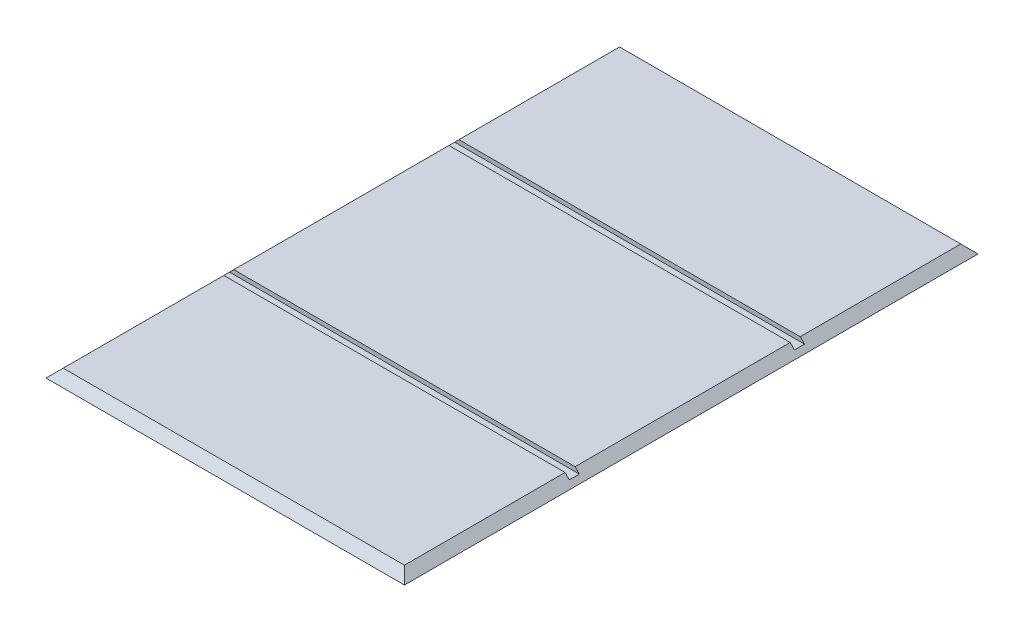
ISO-10303-21;
HEADER;
FILE_DESCRIPTION(('STEP AP214'),'2;1');
FILE_NAME('part.step','',(''),(''),'','','');
FILE_SCHEMA(('AUTOMOTIVE_DESIGN { 1 0 10303 214 1 1 1 1 }'));
ENDSEC;
DATA;
#1=APPLICATION_CONTEXT('core data for automotive mechanical design processes');
#2=APPLICATION_PROTOCOL_DEFINITION('international standard','automotive_design',2000,#1);
#3=PRODUCT_CONTEXT('',#1,'mechanical');
#4=PRODUCT('Part','Part','',(#3));
#5=PRODUCT_RELATED_PRODUCT_CATEGORY('part','',(#4));
#6=PRODUCT_DEFINITION_FORMATION('','',#4);
#7=PRODUCT_DEFINITION_CONTEXT('part definition',#1,'design');
#8=PRODUCT_DEFINITION('design','',#6,#7);
#9=PRODUCT_DEFINITION_SHAPE('','',#8);
#10=(LENGTH_UNIT() NAMED_UNIT(*) SI_UNIT(.MILLI.,.METRE.));
#11=(NAMED_UNIT(*) PLANE_ANGLE_UNIT() SI_UNIT($,.RADIAN.));
#12=(NAMED_UNIT(*) SI_UNIT($,.STERADIAN.) SOLID_ANGLE_UNIT());
#13=UNCERTAINTY_MEASURE_WITH_UNIT(LENGTH_MEASURE(1.E-05),#10,'distance_accuracy_value','');
#14=(GEOMETRIC_REPRESENTATION_CONTEXT(3) GLOBAL_UNCERTAINTY_ASSIGNED_CONTEXT((#13)) GLOBAL_UNIT_ASSIGNED_CONTEXT((#10,
#11,#12)) REPRESENTATION_CONTEXT('',''));
#15=CARTESIAN_POINT('',(0.,0.,0.));
#16=DIRECTION('',(0.,0.,1.));
#17=DIRECTION('',(1.,0.,0.));
#18=AXIS2_PLACEMENT_3D('',#15,#16,#17);
#19=CARTESIAN_POINT('',(0.,12.,-550.));
#20=DIRECTION('',(0.,0.,-1.));
#21=DIRECTION('',(-1.,0.,0.));
#22=AXIS2_PLACEMENT_3D('',#19,#20,#21);
#23=PLANE('',#22);
#24=DIRECTION('',(1.,0.,0.));
#25=VECTOR('',#24,1.);
#26=CARTESIAN_POINT('',(0.,12.,-550.));
#27=LINE('',#26,#25);
#28=CARTESIAN_POINT('',(12.,12.,-550.));
#29=VERTEX_POINT('',#28);
#30=CARTESIAN_POINT('',(488.,12.,-550.));
#31=VERTEX_POINT('',#30);
#32=EDGE_CURVE('E143',#29,#31,#27,.T.);
#33=ORIENTED_EDGE('',*,*,#32,.T.);
#34=DIRECTION('',(0.707106781186548,-0.707106781186548,0.));
#35=VECTOR('',#34,1.);
#36=CARTESIAN_POINT('',(244.,256.,-550.));
#37=LINE('',#36,#35);
#38=CARTESIAN_POINT('',(494.,6.,-550.));
#39=VERTEX_POINT('',#38);
#40=EDGE_CURVE('E205',#31,#39,#37,.T.);
#41=ORIENTED_EDGE('',*,*,#40,.T.);
#42=DIRECTION('',(1.,0.,0.));
#43=VECTOR('',#42,1.);
#44=CARTESIAN_POINT('',(0.,6.,-550.));
#45=LINE('',#44,#43);
#46=CARTESIAN_POINT('',(6.00000000000001,6.,-550.));
#47=VERTEX_POINT('',#46);
#48=EDGE_CURVE('E263',#47,#39,#45,.T.);
#49=ORIENTED_EDGE('',*,*,#48,.F.);
#50=DIRECTION('',(-0.707106781186548,-0.707106781186548,0.));
#51=VECTOR('',#50,1.);
#52=CARTESIAN_POINT('',(6.00000000000001,5.99999999999999,-550.));
#53=LINE('',#52,#51);
#54=EDGE_CURVE('E202',#47,#29,#53,.F.);
#55=ORIENTED_EDGE('',*,*,#54,.T.);
#56=EDGE_LOOP('',(#33,#41,#49,#55));
#57=FACE_BOUND('',#56,.T.);
#58=ADVANCED_FACE('F41',(#57),#23,.T.);
#59=CARTESIAN_POINT('',(0.,12.,-250.));
#60=DIRECTION('',(0.,0.,-1.));
#61=DIRECTION('',(-1.,0.,0.));
#62=AXIS2_PLACEMENT_3D('',#59,#60,#61);
#63=PLANE('',#62);
#64=DIRECTION('',(1.,0.,0.));
#65=VECTOR('',#64,1.);
#66=CARTESIAN_POINT('',(0.,6.,-250.));
#67=LINE('',#66,#65);
#68=CARTESIAN_POINT('',(6.00000000000001,6.,-250.));
#69=VERTEX_POINT('',#68);
#70=CARTESIAN_POINT('',(494.,6.,-250.));
#71=VERTEX_POINT('',#70);
#72=EDGE_CURVE('E286',#69,#71,#67,.T.);
#73=ORIENTED_EDGE('',*,*,#72,.T.);
#74=DIRECTION('',(-0.707106781186548,0.707106781186548,0.));
#75=VECTOR('',#74,1.);
#76=CARTESIAN_POINT('',(488.,12.,-250.));
#77=LINE('',#76,#75);
#78=CARTESIAN_POINT('',(488.,12.,-250.));
#79=VERTEX_POINT('',#78);
#80=EDGE_CURVE('E213',#71,#79,#77,.T.);
#81=ORIENTED_EDGE('',*,*,#80,.T.);
#82=DIRECTION('',(1.,0.,0.));
#83=VECTOR('',#82,1.);
#84=CARTESIAN_POINT('',(0.,12.,-250.));
#85=LINE('',#84,#83);
#86=CARTESIAN_POINT('',(12.,12.,-250.));
#87=VERTEX_POINT('',#86);
#88=EDGE_CURVE('E180',#87,#79,#85,.T.);
#89=ORIENTED_EDGE('',*,*,#88,.F.);
#90=DIRECTION('',(0.707106781186548,0.707106781186548,0.));
#91=VECTOR('',#90,1.);
#92=CARTESIAN_POINT('',(0.,0.,-250.));
#93=LINE('',#92,#91);
#94=EDGE_CURVE('E209',#87,#69,#93,.F.);
#95=ORIENTED_EDGE('',*,*,#94,.T.);
#96=EDGE_LOOP('',(#73,#81,#89,#95));
#97=FACE_BOUND('',#96,.T.);
#98=ADVANCED_FACE('F281',(#97),#63,.F.);
#99=CARTESIAN_POINT('',(0.,12.,0.));
#100=DIRECTION('',(0.,1.,0.));
#101=DIRECTION('',(0.,0.,1.));
#102=AXIS2_PLACEMENT_3D('',#99,#100,#101);
#103=PLANE('',#102);
#104=ORIENTED_EDGE('',*,*,#88,.T.);
#105=DIRECTION('',(0.,0.,-1.));
#106=VECTOR('',#105,1.);
#107=CARTESIAN_POINT('',(488.,12.,-550.));
#108=LINE('',#107,#106);
#109=EDGE_CURVE('E198',#79,#31,#108,.T.);
#110=ORIENTED_EDGE('',*,*,#109,.T.);
#111=ORIENTED_EDGE('',*,*,#32,.F.);
#112=DIRECTION('',(0.,0.,1.));
#113=VECTOR('',#112,1.);
#114=CARTESIAN_POINT('',(12.,12.,0.));
#115=LINE('',#114,#113);
#116=EDGE_CURVE('E195',#29,#87,#115,.T.);
#117=ORIENTED_EDGE('',*,*,#116,.T.);
#118=EDGE_LOOP('',(#104,#110,#111,#117));
#119=FACE_BOUND('',#118,.T.);
#120=ADVANCED_FACE('F279',(#119),#103,.T.);
#121=CARTESIAN_POINT('',(0.,0.,0.));
#122=DIRECTION('',(0.,1.,0.));
#123=DIRECTION('',(0.,0.,1.));
#124=AXIS2_PLACEMENT_3D('',#121,#122,#123);
#125=PLANE('',#124);
#126=DIRECTION('',(0.,0.,-1.));
#127=VECTOR('',#126,1.);
#128=CARTESIAN_POINT('',(0.,0.,0.));
#129=LINE('',#128,#127);
#130=CARTESIAN_POINT('',(0.,0.,0.));
#131=VERTEX_POINT('',#130);
#132=CARTESIAN_POINT('',(0.,0.,-800.));
#133=VERTEX_POINT('',#132);
#134=EDGE_CURVE('E144',#131,#133,#129,.T.);
#135=ORIENTED_EDGE('',*,*,#134,.T.);
#136=DIRECTION('',(1.,0.,0.));
#137=VECTOR('',#136,1.);
#138=CARTESIAN_POINT('',(0.,0.,-800.));
#139=LINE('',#138,#137);
#140=CARTESIAN_POINT('',(500.,0.,-800.));
#141=VERTEX_POINT('',#140);
#142=EDGE_CURVE('E147',#133,#141,#139,.T.);
#143=ORIENTED_EDGE('',*,*,#142,.T.);
#144=DIRECTION('',(0.,0.,-1.));
#145=VECTOR('',#144,1.);
#146=CARTESIAN_POINT('',(500.,0.,0.));
#147=LINE('',#146,#145);
#148=CARTESIAN_POINT('',(500.,0.,0.));
#149=VERTEX_POINT('',#148);
#150=EDGE_CURVE('E131',#149,#141,#147,.T.);
#151=ORIENTED_EDGE('',*,*,#150,.F.);
#152=DIRECTION('',(1.,0.,0.));
#153=VECTOR('',#152,1.);
#154=CARTESIAN_POINT('',(0.,0.,0.));
#155=LINE('',#154,#153);
#156=EDGE_CURVE('E154',#131,#149,#155,.T.);
#157=ORIENTED_EDGE('',*,*,#156,.F.);
#158=EDGE_LOOP('',(#135,#143,#151,#157));
#159=FACE_BOUND('',#158,.T.);
#160=ADVANCED_FACE('F148',(#159),#125,.F.);
#161=CARTESIAN_POINT('',(0.,6.,0.));
#162=DIRECTION('',(0.,1.,0.));
#163=DIRECTION('',(0.,0.,1.));
#164=AXIS2_PLACEMENT_3D('',#161,#162,#163);
#165=PLANE('',#164);
#166=ORIENTED_EDGE('',*,*,#72,.F.);
#167=DIRECTION('',(0.,0.,-1.));
#168=VECTOR('',#167,1.);
#169=CARTESIAN_POINT('',(6.00000000000001,6.,0.));
#170=LINE('',#169,#168);
#171=CARTESIAN_POINT('',(6.00000000000001,6.,-236.));
#172=VERTEX_POINT('',#171);
#173=EDGE_CURVE('E214',#69,#172,#170,.F.);
#174=ORIENTED_EDGE('',*,*,#173,.T.);
#175=DIRECTION('',(1.,0.,0.));
#176=VECTOR('',#175,1.);
#177=CARTESIAN_POINT('',(0.,6.,-236.));
#178=LINE('',#177,#176);
#179=CARTESIAN_POINT('',(494.,6.,-236.));
#180=VERTEX_POINT('',#179);
#181=EDGE_CURVE('E235',#172,#180,#178,.T.);
#182=ORIENTED_EDGE('',*,*,#181,.T.);
#183=DIRECTION('',(0.,0.,-1.));
#184=VECTOR('',#183,1.);
#185=CARTESIAN_POINT('',(494.,6.,0.));
#186=LINE('',#185,#184);
#187=EDGE_CURVE('E208',#180,#71,#186,.T.);
#188=ORIENTED_EDGE('',*,*,#187,.T.);
#189=EDGE_LOOP('',(#166,#174,#182,#188));
#190=FACE_BOUND('',#189,.T.);
#191=ADVANCED_FACE('F379',(#190),#165,.T.);
#192=CARTESIAN_POINT('',(0.,12.,-236.));
#193=DIRECTION('',(0.,0.,-1.));
#194=DIRECTION('',(-1.,0.,0.));
#195=AXIS2_PLACEMENT_3D('',#192,#193,#194);
#196=PLANE('',#195);
#197=ORIENTED_EDGE('',*,*,#181,.F.);
#198=DIRECTION('',(-0.707106781186548,-0.707106781186548,0.));
#199=VECTOR('',#198,1.);
#200=CARTESIAN_POINT('',(6.00000000000001,5.99999999999999,-236.));
#201=LINE('',#200,#199);
#202=CARTESIAN_POINT('',(12.,12.,-236.));
#203=VERTEX_POINT('',#202);
#204=EDGE_CURVE('E220',#172,#203,#201,.F.);
#205=ORIENTED_EDGE('',*,*,#204,.T.);
#206=DIRECTION('',(1.,0.,0.));
#207=VECTOR('',#206,1.);
#208=CARTESIAN_POINT('',(0.,12.,-236.));
#209=LINE('',#208,#207);
#210=CARTESIAN_POINT('',(488.,12.,-236.));
#211=VERTEX_POINT('',#210);
#212=EDGE_CURVE('E228',#203,#211,#209,.T.);
#213=ORIENTED_EDGE('',*,*,#212,.T.);
#214=DIRECTION('',(0.707106781186548,-0.707106781186548,0.));
#215=VECTOR('',#214,1.);
#216=CARTESIAN_POINT('',(244.,256.,-236.));
#217=LINE('',#216,#215);
#218=EDGE_CURVE('E217',#211,#180,#217,.T.);
#219=ORIENTED_EDGE('',*,*,#218,.T.);
#220=EDGE_LOOP('',(#197,#205,#213,#219));
#221=FACE_BOUND('',#220,.T.);
#222=ADVANCED_FACE('F231',(#221),#196,.T.);
#223=CARTESIAN_POINT('',(0.,12.,0.));
#224=DIRECTION('',(0.,1.,0.));
#225=DIRECTION('',(0.,0.,1.));
#226=AXIS2_PLACEMENT_3D('',#223,#224,#225);
#227=PLANE('',#226);
#228=ORIENTED_EDGE('',*,*,#212,.F.);
#229=DIRECTION('',(0.,0.,1.));
#230=VECTOR('',#229,1.);
#231=CARTESIAN_POINT('',(12.,12.,0.));
#232=LINE('',#231,#230);
#233=CARTESIAN_POINT('',(12.,12.,-12.));
#234=VERTEX_POINT('',#233);
#235=EDGE_CURVE('E11',#203,#234,#232,.T.);
#236=ORIENTED_EDGE('',*,*,#235,.T.);
#237=DIRECTION('',(1.,0.,0.));
#238=VECTOR('',#237,1.);
#239=CARTESIAN_POINT('',(500.,12.,-12.));
#240=LINE('',#239,#238);
#241=CARTESIAN_POINT('',(488.,12.,-12.));
#242=VERTEX_POINT('',#241);
#243=EDGE_CURVE('E59',#234,#242,#240,.T.);
#244=ORIENTED_EDGE('',*,*,#243,.T.);
#245=DIRECTION('',(0.,0.,-1.));
#246=VECTOR('',#245,1.);
#247=CARTESIAN_POINT('',(488.,12.,-236.));
#248=LINE('',#247,#246);
#249=EDGE_CURVE('E52',#242,#211,#248,.T.);
#250=ORIENTED_EDGE('',*,*,#249,.T.);
#251=EDGE_LOOP('',(#228,#236,#244,#250));
#252=FACE_BOUND('',#251,.T.);
#253=ADVANCED_FACE('F227',(#252),#227,.T.);
#254=CARTESIAN_POINT('',(0.,6.,0.));
#255=DIRECTION('',(0.,1.,0.));
#256=DIRECTION('',(0.,0.,1.));
#257=AXIS2_PLACEMENT_3D('',#254,#255,#256);
#258=PLANE('',#257);
#259=DIRECTION('',(0.,0.,-1.));
#260=VECTOR('',#259,1.);
#261=CARTESIAN_POINT('',(494.,6.,0.));
#262=LINE('',#261,#260);
#263=CARTESIAN_POINT('',(494.,6.,-564.));
#264=VERTEX_POINT('',#263);
#265=EDGE_CURVE('E199',#39,#264,#262,.T.);
#266=ORIENTED_EDGE('',*,*,#265,.T.);
#267=DIRECTION('',(1.,0.,0.));
#268=VECTOR('',#267,1.);
#269=CARTESIAN_POINT('',(0.,6.,-564.));
#270=LINE('',#269,#268);
#271=CARTESIAN_POINT('',(6.00000000000012,6.,-564.));
#272=VERTEX_POINT('',#271);
#273=EDGE_CURVE('E236',#272,#264,#270,.T.);
#274=ORIENTED_EDGE('',*,*,#273,.F.);
#275=DIRECTION('',(0.,0.,-1.));
#276=VECTOR('',#275,1.);
#277=CARTESIAN_POINT('',(6.00000000000001,6.,0.));
#278=LINE('',#277,#276);
#279=EDGE_CURVE('E194',#272,#47,#278,.F.);
#280=ORIENTED_EDGE('',*,*,#279,.T.);
#281=ORIENTED_EDGE('',*,*,#48,.T.);
#282=EDGE_LOOP('',(#266,#274,#280,#281));
#283=FACE_BOUND('',#282,.T.);
#284=ADVANCED_FACE('F262',(#283),#258,.T.);
#285=CARTESIAN_POINT('',(0.,12.,-564.));
#286=DIRECTION('',(0.,0.,-1.));
#287=DIRECTION('',(-1.,0.,0.));
#288=AXIS2_PLACEMENT_3D('',#285,#286,#287);
#289=PLANE('',#288);
#290=DIRECTION('',(1.,0.,0.));
#291=VECTOR('',#290,1.);
#292=CARTESIAN_POINT('',(0.,12.,-564.));
#293=LINE('',#292,#291);
#294=CARTESIAN_POINT('',(12.0000000000001,12.,-564.));
#295=VERTEX_POINT('',#294);
#296=CARTESIAN_POINT('',(488.,12.,-564.));
#297=VERTEX_POINT('',#296);
#298=EDGE_CURVE('E271',#295,#297,#293,.T.);
#299=ORIENTED_EDGE('',*,*,#298,.F.);
#300=DIRECTION('',(0.707106781186548,0.707106781186548,0.));
#301=VECTOR('',#300,1.);
#302=CARTESIAN_POINT('',(0.,-1.21430643318376E-13,-564.));
#303=LINE('',#302,#301);
#304=EDGE_CURVE('E190',#295,#272,#303,.F.);
#305=ORIENTED_EDGE('',*,*,#304,.T.);
#306=ORIENTED_EDGE('',*,*,#273,.T.);
#307=DIRECTION('',(-0.707106781186548,0.707106781186548,0.));
#308=VECTOR('',#307,1.);
#309=CARTESIAN_POINT('',(488.,12.,-564.));
#310=LINE('',#309,#308);
#311=EDGE_CURVE('E187',#264,#297,#310,.T.);
#312=ORIENTED_EDGE('',*,*,#311,.T.);
#313=EDGE_LOOP('',(#299,#305,#306,#312));
#314=FACE_BOUND('',#313,.T.);
#315=ADVANCED_FACE('F306',(#314),#289,.F.);
#316=CARTESIAN_POINT('',(0.,12.,0.));
#317=DIRECTION('',(0.,1.,0.));
#318=DIRECTION('',(0.,0.,1.));
#319=AXIS2_PLACEMENT_3D('',#316,#317,#318);
#320=PLANE('',#319);
#321=DIRECTION('',(-1.,0.,0.));
#322=VECTOR('',#321,1.);
#323=CARTESIAN_POINT('',(0.,12.,-788.));
#324=LINE('',#323,#322);
#325=CARTESIAN_POINT('',(488.,12.,-788.));
#326=VERTEX_POINT('',#325);
#327=CARTESIAN_POINT('',(12.0000000000001,12.,-788.));
#328=VERTEX_POINT('',#327);
#329=EDGE_CURVE('E157',#326,#328,#324,.T.);
#330=ORIENTED_EDGE('',*,*,#329,.T.);
#331=DIRECTION('',(0.,0.,1.));
#332=VECTOR('',#331,1.);
#333=CARTESIAN_POINT('',(12.0000000000001,12.,0.));
#334=LINE('',#333,#332);
#335=EDGE_CURVE('E183',#328,#295,#334,.T.);
#336=ORIENTED_EDGE('',*,*,#335,.T.);
#337=ORIENTED_EDGE('',*,*,#298,.T.);
#338=DIRECTION('',(0.,0.,-1.));
#339=VECTOR('',#338,1.);
#340=CARTESIAN_POINT('',(488.,12.,-800.));
#341=LINE('',#340,#339);
#342=EDGE_CURVE('E177',#297,#326,#341,.T.);
#343=ORIENTED_EDGE('',*,*,#342,.T.);
#344=EDGE_LOOP('',(#330,#336,#337,#343));
#345=FACE_BOUND('',#344,.T.);
#346=ADVANCED_FACE('F304',(#345),#320,.T.);
#347=CARTESIAN_POINT('',(488.,12.,0.));
#348=DIRECTION('',(0.707106781186547,0.707106781186547,0.));
#349=DIRECTION('',(0.,0.,1.));
#350=AXIS2_PLACEMENT_3D('',#347,#348,#349);
#351=PLANE('',#350);
#352=ORIENTED_EDGE('',*,*,#218,.F.);
#353=ORIENTED_EDGE('',*,*,#249,.F.);
#354=DIRECTION('',(-0.577350269189626,0.577350269189626,-0.577350269189626));
#355=VECTOR('',#354,1.);
#356=CARTESIAN_POINT('',(325.333333333333,174.666666666667,-174.666666666667));
#357=LINE('',#356,#355);
#358=EDGE_CURVE('E139',#149,#242,#357,.T.);
#359=ORIENTED_EDGE('',*,*,#358,.F.);
#360=ORIENTED_EDGE('',*,*,#150,.T.);
#361=DIRECTION('',(0.577350269189626,-0.577350269189626,-0.577350269189626));
#362=VECTOR('',#361,1.);
#363=CARTESIAN_POINT('',(225.333333333333,274.666666666667,-525.333333333333));
#364=LINE('',#363,#362);
#365=EDGE_CURVE('E136',#326,#141,#364,.T.);
#366=ORIENTED_EDGE('',*,*,#365,.F.);
#367=ORIENTED_EDGE('',*,*,#342,.F.);
#368=ORIENTED_EDGE('',*,*,#311,.F.);
#369=ORIENTED_EDGE('',*,*,#265,.F.);
#370=ORIENTED_EDGE('',*,*,#40,.F.);
#371=ORIENTED_EDGE('',*,*,#109,.F.);
#372=ORIENTED_EDGE('',*,*,#80,.F.);
#373=ORIENTED_EDGE('',*,*,#187,.F.);
#374=EDGE_LOOP('',(#352,#353,#359,#360,#366,#367,#368,#369,#370,#371,#372,#373));
#375=FACE_BOUND('',#374,.T.);
#376=ADVANCED_FACE('F44',(#375),#351,.T.);
#377=CARTESIAN_POINT('',(0.,12.,-12.));
#378=DIRECTION('',(0.,0.707106781186547,0.707106781186547));
#379=DIRECTION('',(-1.,0.,0.));
#380=AXIS2_PLACEMENT_3D('',#377,#378,#379);
#381=PLANE('',#380);
#382=ORIENTED_EDGE('',*,*,#358,.T.);
#383=ORIENTED_EDGE('',*,*,#243,.F.);
#384=DIRECTION('',(0.577350269189626,0.577350269189626,-0.577350269189626));
#385=VECTOR('',#384,1.);
#386=CARTESIAN_POINT('',(8.00000000000001,8.,-8.00000000000001));
#387=LINE('',#386,#385);
#388=EDGE_CURVE('E159',#131,#234,#387,.T.);
#389=ORIENTED_EDGE('',*,*,#388,.F.);
#390=ORIENTED_EDGE('',*,*,#156,.T.);
#391=EDGE_LOOP('',(#382,#383,#389,#390));
#392=FACE_BOUND('',#391,.T.);
#393=ADVANCED_FACE('F299',(#392),#381,.T.);
#394=CARTESIAN_POINT('',(0.,0.,0.));
#395=DIRECTION('',(0.707106781186547,-0.707106781186547,0.));
#396=DIRECTION('',(0.,0.,-1.));
#397=AXIS2_PLACEMENT_3D('',#394,#395,#396);
#398=PLANE('',#397);
#399=ORIENTED_EDGE('',*,*,#204,.F.);
#400=ORIENTED_EDGE('',*,*,#173,.F.);
#401=ORIENTED_EDGE('',*,*,#94,.F.);
#402=ORIENTED_EDGE('',*,*,#116,.F.);
#403=ORIENTED_EDGE('',*,*,#54,.F.);
#404=ORIENTED_EDGE('',*,*,#279,.F.);
#405=ORIENTED_EDGE('',*,*,#304,.F.);
#406=ORIENTED_EDGE('',*,*,#335,.F.);
#407=DIRECTION('',(0.577350269189626,0.577350269189626,0.577350269189626));
#408=VECTOR('',#407,1.);
#409=CARTESIAN_POINT('',(0.,-1.21430643318376E-13,-800.));
#410=LINE('',#409,#408);
#411=EDGE_CURVE('E160',#328,#133,#410,.F.);
#412=ORIENTED_EDGE('',*,*,#411,.T.);
#413=ORIENTED_EDGE('',*,*,#134,.F.);
#414=ORIENTED_EDGE('',*,*,#388,.T.);
#415=ORIENTED_EDGE('',*,*,#235,.F.);
#416=EDGE_LOOP('',(#399,#400,#401,#402,#403,#404,#405,#406,#412,#413,#414,#415));
#417=FACE_BOUND('',#416,.T.);
#418=ADVANCED_FACE('F274',(#417),#398,.F.);
#419=CARTESIAN_POINT('',(0.,-1.21430643318376E-13,-800.));
#420=DIRECTION('',(0.,-0.707106781186547,0.707106781186547));
#421=DIRECTION('',(1.,0.,0.));
#422=AXIS2_PLACEMENT_3D('',#419,#420,#421);
#423=PLANE('',#422);
#424=ORIENTED_EDGE('',*,*,#365,.T.);
#425=ORIENTED_EDGE('',*,*,#142,.F.);
#426=ORIENTED_EDGE('',*,*,#411,.F.);
#427=ORIENTED_EDGE('',*,*,#329,.F.);
#428=EDGE_LOOP('',(#424,#425,#426,#427));
#429=FACE_BOUND('',#428,.T.);
#430=ADVANCED_FACE('F156',(#429),#423,.F.);
#431=CLOSED_SHELL('',(#58,#98,#120,#160,#191,#222,#253,#284,#315,#346,#376,#393,#418,#430));
#432=MANIFOLD_SOLID_BREP('B2',#431);
#433=ADVANCED_BREP_SHAPE_REPRESENTATION('',(#18,#432),#14);
#434=SHAPE_DEFINITION_REPRESENTATION(#9,#433);
ENDSEC;
END-ISO-10303-21;
